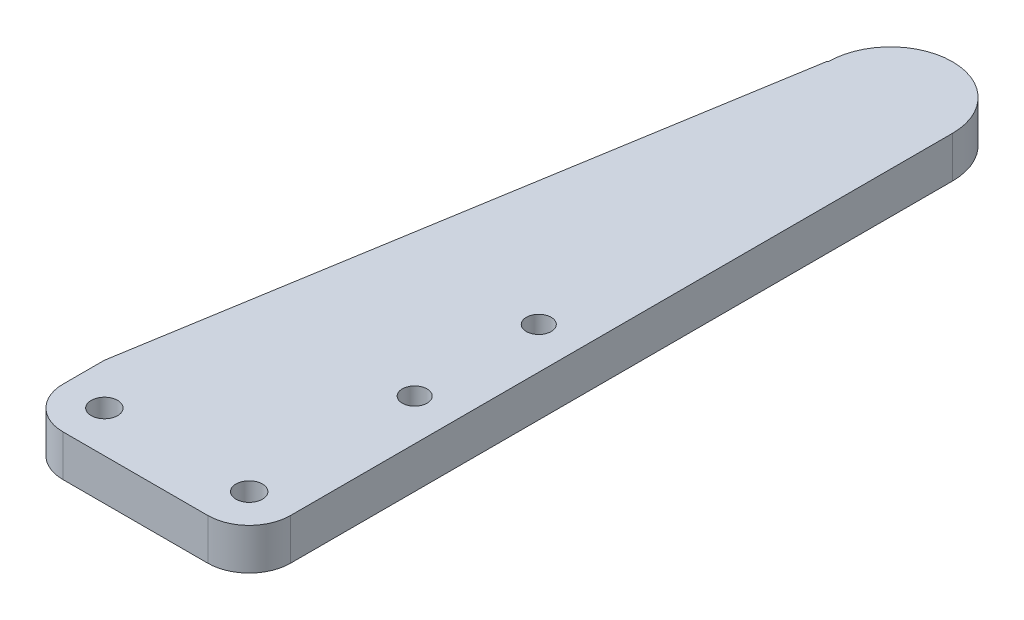
ISO-10303-21;
HEADER;
FILE_DESCRIPTION(('STEP AP214'),'2;1');
FILE_NAME('part.step','',(''),(''),'','','');
FILE_SCHEMA(('AUTOMOTIVE_DESIGN { 1 0 10303 214 1 1 1 1 }'));
ENDSEC;
DATA;
#1=APPLICATION_CONTEXT('core data for automotive mechanical design processes');
#2=APPLICATION_PROTOCOL_DEFINITION('international standard','automotive_design',2000,#1);
#3=PRODUCT_CONTEXT('',#1,'mechanical');
#4=PRODUCT('Part','Part','',(#3));
#5=PRODUCT_RELATED_PRODUCT_CATEGORY('part','',(#4));
#6=PRODUCT_DEFINITION_FORMATION('','',#4);
#7=PRODUCT_DEFINITION_CONTEXT('part definition',#1,'design');
#8=PRODUCT_DEFINITION('design','',#6,#7);
#9=PRODUCT_DEFINITION_SHAPE('','',#8);
#10=(LENGTH_UNIT() NAMED_UNIT(*) SI_UNIT(.MILLI.,.METRE.));
#11=(NAMED_UNIT(*) PLANE_ANGLE_UNIT() SI_UNIT($,.RADIAN.));
#12=(NAMED_UNIT(*) SI_UNIT($,.STERADIAN.) SOLID_ANGLE_UNIT());
#13=UNCERTAINTY_MEASURE_WITH_UNIT(LENGTH_MEASURE(1.E-05),#10,'distance_accuracy_value','');
#14=(GEOMETRIC_REPRESENTATION_CONTEXT(3) GLOBAL_UNCERTAINTY_ASSIGNED_CONTEXT((#13)) GLOBAL_UNIT_ASSIGNED_CONTEXT((#10,
#11,#12)) REPRESENTATION_CONTEXT('',''));
#15=CARTESIAN_POINT('',(0.,0.,0.));
#16=DIRECTION('',(0.,0.,1.));
#17=DIRECTION('',(1.,0.,0.));
#18=AXIS2_PLACEMENT_3D('',#15,#16,#17);
#19=CARTESIAN_POINT('',(6.25000000000002,5.,-42.5));
#20=DIRECTION('',(0.,-1.,0.));
#21=DIRECTION('',(0.,0.,-1.));
#22=AXIS2_PLACEMENT_3D('',#19,#20,#21);
#23=CYLINDRICAL_SURFACE('',#22,7.49999999999999);
#24=CARTESIAN_POINT('',(6.25000000000002,0.,-42.5));
#25=DIRECTION('',(0.,1.,0.));
#26=DIRECTION('',(0.,0.,1.));
#27=AXIS2_PLACEMENT_3D('',#24,#25,#26);
#28=CIRCLE('',#27,7.49999999999999);
#29=CARTESIAN_POINT('',(13.75,0.,-42.5));
#30=VERTEX_POINT('',#29);
#31=CARTESIAN_POINT('',(-1.24999999999997,0.,-42.5));
#32=VERTEX_POINT('',#31);
#33=EDGE_CURVE('E119',#30,#32,#28,.T.);
#34=ORIENTED_EDGE('',*,*,#33,.T.);
#35=DIRECTION('',(0.,-1.,0.));
#36=VECTOR('',#35,1.);
#37=CARTESIAN_POINT('',(-1.24999999999997,5.,-42.5));
#38=LINE('',#37,#36);
#39=CARTESIAN_POINT('',(-1.24999999999997,5.,-42.5));
#40=VERTEX_POINT('',#39);
#41=EDGE_CURVE('E117',#40,#32,#38,.T.);
#42=ORIENTED_EDGE('',*,*,#41,.F.);
#43=CARTESIAN_POINT('',(6.25000000000002,5.,-42.5));
#44=DIRECTION('',(0.,1.,0.));
#45=DIRECTION('',(0.,0.,1.));
#46=AXIS2_PLACEMENT_3D('',#43,#44,#45);
#47=CIRCLE('',#46,7.49999999999999);
#48=CARTESIAN_POINT('',(13.75,5.,-42.5));
#49=VERTEX_POINT('',#48);
#50=EDGE_CURVE('E103',#49,#40,#47,.T.);
#51=ORIENTED_EDGE('',*,*,#50,.F.);
#52=DIRECTION('',(0.,-1.,0.));
#53=VECTOR('',#52,1.);
#54=CARTESIAN_POINT('',(13.75,5.,-42.5));
#55=LINE('',#54,#53);
#56=EDGE_CURVE('E149',#49,#30,#55,.T.);
#57=ORIENTED_EDGE('',*,*,#56,.T.);
#58=EDGE_LOOP('',(#34,#42,#51,#57));
#59=FACE_BOUND('',#58,.T.);
#60=ADVANCED_FACE('F37',(#59),#23,.T.);
#61=CARTESIAN_POINT('',(0.,5.,-42.5));
#62=DIRECTION('',(0.,0.,-1.));
#63=DIRECTION('',(-1.,0.,0.));
#64=AXIS2_PLACEMENT_3D('',#61,#62,#63);
#65=PLANE('',#64);
#66=DIRECTION('',(1.,0.,0.));
#67=VECTOR('',#66,1.);
#68=CARTESIAN_POINT('',(0.,0.,-42.5));
#69=LINE('',#68,#67);
#70=CARTESIAN_POINT('',(-1.35178643452647,0.,-42.5));
#71=VERTEX_POINT('',#70);
#72=EDGE_CURVE('E151',#71,#32,#69,.T.);
#73=ORIENTED_EDGE('',*,*,#72,.F.);
#74=DIRECTION('',(0.,-1.,0.));
#75=VECTOR('',#74,1.);
#76=CARTESIAN_POINT('',(-1.35178643452647,5.,-42.5));
#77=LINE('',#76,#75);
#78=CARTESIAN_POINT('',(-1.35178643452647,5.,-42.5));
#79=VERTEX_POINT('',#78);
#80=EDGE_CURVE('E124',#79,#71,#77,.T.);
#81=ORIENTED_EDGE('',*,*,#80,.F.);
#82=DIRECTION('',(1.,0.,0.));
#83=VECTOR('',#82,1.);
#84=CARTESIAN_POINT('',(0.,5.,-42.5));
#85=LINE('',#84,#83);
#86=EDGE_CURVE('E109',#79,#40,#85,.T.);
#87=ORIENTED_EDGE('',*,*,#86,.T.);
#88=ORIENTED_EDGE('',*,*,#41,.T.);
#89=EDGE_LOOP('',(#73,#81,#87,#88));
#90=FACE_BOUND('',#89,.T.);
#91=ADVANCED_FACE('F126',(#90),#65,.T.);
#92=CARTESIAN_POINT('',(-8.15459816396523,5.,-1.34803266103279));
#93=DIRECTION('',(0.986610195458243,0.,0.163096052122198));
#94=DIRECTION('',(0.163096052122198,0.,-0.986610195458243));
#95=AXIS2_PLACEMENT_3D('',#92,#93,#94);
#96=PLANE('',#95);
#97=DIRECTION('',(-0.163096052122198,0.,0.986610195458243));
#98=VECTOR('',#97,1.);
#99=CARTESIAN_POINT('',(-8.15459816396523,0.,-1.34803266103279));
#100=LINE('',#99,#98);
#101=CARTESIAN_POINT('',(-13.75,0.,32.5));
#102=VERTEX_POINT('',#101);
#103=EDGE_CURVE('E153',#71,#102,#100,.T.);
#104=ORIENTED_EDGE('',*,*,#103,.T.);
#105=DIRECTION('',(0.,-1.,0.));
#106=VECTOR('',#105,1.);
#107=CARTESIAN_POINT('',(-13.75,5.,32.5));
#108=LINE('',#107,#106);
#109=CARTESIAN_POINT('',(-13.75,5.,32.5));
#110=VERTEX_POINT('',#109);
#111=EDGE_CURVE('E175',#110,#102,#108,.T.);
#112=ORIENTED_EDGE('',*,*,#111,.F.);
#113=DIRECTION('',(-0.163096052122198,0.,0.986610195458243));
#114=VECTOR('',#113,1.);
#115=CARTESIAN_POINT('',(-8.15459816396523,5.,-1.34803266103279));
#116=LINE('',#115,#114);
#117=EDGE_CURVE('E128',#79,#110,#116,.T.);
#118=ORIENTED_EDGE('',*,*,#117,.F.);
#119=ORIENTED_EDGE('',*,*,#80,.T.);
#120=EDGE_LOOP('',(#104,#112,#118,#119));
#121=FACE_BOUND('',#120,.T.);
#122=ADVANCED_FACE('F204',(#121),#96,.F.);
#123=CARTESIAN_POINT('',(-13.75,5.,0.));
#124=DIRECTION('',(-1.,0.,0.));
#125=DIRECTION('',(0.,0.,1.));
#126=AXIS2_PLACEMENT_3D('',#123,#124,#125);
#127=PLANE('',#126);
#128=DIRECTION('',(0.,0.,-1.));
#129=VECTOR('',#128,1.);
#130=CARTESIAN_POINT('',(-13.75,0.,0.));
#131=LINE('',#130,#129);
#132=CARTESIAN_POINT('',(-13.75,0.,37.5));
#133=VERTEX_POINT('',#132);
#134=EDGE_CURVE('E156',#133,#102,#131,.T.);
#135=ORIENTED_EDGE('',*,*,#134,.F.);
#136=DIRECTION('',(0.,-1.,0.));
#137=VECTOR('',#136,1.);
#138=CARTESIAN_POINT('',(-13.75,5.,37.5));
#139=LINE('',#138,#137);
#140=CARTESIAN_POINT('',(-13.75,5.,37.5));
#141=VERTEX_POINT('',#140);
#142=EDGE_CURVE('E60',#133,#141,#139,.F.);
#143=ORIENTED_EDGE('',*,*,#142,.T.);
#144=DIRECTION('',(0.,0.,-1.));
#145=VECTOR('',#144,1.);
#146=CARTESIAN_POINT('',(-13.75,5.,0.));
#147=LINE('',#146,#145);
#148=EDGE_CURVE('E130',#141,#110,#147,.T.);
#149=ORIENTED_EDGE('',*,*,#148,.T.);
#150=ORIENTED_EDGE('',*,*,#111,.T.);
#151=EDGE_LOOP('',(#135,#143,#149,#150));
#152=FACE_BOUND('',#151,.T.);
#153=ADVANCED_FACE('F201',(#152),#127,.T.);
#154=CARTESIAN_POINT('',(0.,5.,42.5));
#155=DIRECTION('',(0.,0.,-1.));
#156=DIRECTION('',(-1.,0.,0.));
#157=AXIS2_PLACEMENT_3D('',#154,#155,#156);
#158=PLANE('',#157);
#159=DIRECTION('',(1.,0.,0.));
#160=VECTOR('',#159,1.);
#161=CARTESIAN_POINT('',(0.,5.,42.5));
#162=LINE('',#161,#160);
#163=CARTESIAN_POINT('',(-8.75,5.,42.5));
#164=VERTEX_POINT('',#163);
#165=CARTESIAN_POINT('',(8.75000000000001,5.,42.5));
#166=VERTEX_POINT('',#165);
#167=EDGE_CURVE('E134',#164,#166,#162,.T.);
#168=ORIENTED_EDGE('',*,*,#167,.F.);
#169=DIRECTION('',(0.,-1.,0.));
#170=VECTOR('',#169,1.);
#171=CARTESIAN_POINT('',(-8.75,0.,42.5));
#172=LINE('',#171,#170);
#173=CARTESIAN_POINT('',(-8.75,0.,42.5));
#174=VERTEX_POINT('',#173);
#175=EDGE_CURVE('E180',#164,#174,#172,.T.);
#176=ORIENTED_EDGE('',*,*,#175,.T.);
#177=DIRECTION('',(1.,0.,0.));
#178=VECTOR('',#177,1.);
#179=CARTESIAN_POINT('',(0.,0.,42.5));
#180=LINE('',#179,#178);
#181=CARTESIAN_POINT('',(8.75000000000001,0.,42.5));
#182=VERTEX_POINT('',#181);
#183=EDGE_CURVE('E158',#174,#182,#180,.T.);
#184=ORIENTED_EDGE('',*,*,#183,.T.);
#185=DIRECTION('',(0.,-1.,0.));
#186=VECTOR('',#185,1.);
#187=CARTESIAN_POINT('',(8.75000000000001,5.,42.5));
#188=LINE('',#187,#186);
#189=EDGE_CURVE('E123',#182,#166,#188,.F.);
#190=ORIENTED_EDGE('',*,*,#189,.T.);
#191=EDGE_LOOP('',(#168,#176,#184,#190));
#192=FACE_BOUND('',#191,.T.);
#193=ADVANCED_FACE('F193',(#192),#158,.F.);
#194=CARTESIAN_POINT('',(-8.75,5.,37.5));
#195=DIRECTION('',(0.,-1.,0.));
#196=DIRECTION('',(0.,0.,-1.));
#197=AXIS2_PLACEMENT_3D('',#194,#195,#196);
#198=CYLINDRICAL_SURFACE('',#197,1.59999999999999);
#199=CARTESIAN_POINT('',(-8.75,5.,37.5));
#200=DIRECTION('',(0.,1.,0.));
#201=DIRECTION('',(0.,0.,1.));
#202=AXIS2_PLACEMENT_3D('',#199,#200,#201);
#203=CIRCLE('',#202,1.59999999999999);
#204=CARTESIAN_POINT('',(-8.75,5.,39.1));
#205=VERTEX_POINT('',#204);
#206=EDGE_CURVE('E143',#205,#205,#203,.T.);
#207=ORIENTED_EDGE('',*,*,#206,.T.);
#208=EDGE_LOOP('',(#207));
#209=FACE_BOUND('',#208,.T.);
#210=CARTESIAN_POINT('',(-8.75,0.,37.5));
#211=DIRECTION('',(0.,1.,0.));
#212=DIRECTION('',(0.,0.,1.));
#213=AXIS2_PLACEMENT_3D('',#210,#211,#212);
#214=CIRCLE('',#213,1.59999999999999);
#215=CARTESIAN_POINT('',(-8.75,0.,39.1));
#216=VERTEX_POINT('',#215);
#217=EDGE_CURVE('E169',#216,#216,#214,.T.);
#218=ORIENTED_EDGE('',*,*,#217,.F.);
#219=EDGE_LOOP('',(#218));
#220=FACE_BOUND('',#219,.T.);
#221=ADVANCED_FACE('F227',(#209,#220),#198,.F.);
#222=CARTESIAN_POINT('',(8.75000000000001,5.,17.5));
#223=DIRECTION('',(0.,-1.,0.));
#224=DIRECTION('',(0.,0.,-1.));
#225=AXIS2_PLACEMENT_3D('',#222,#223,#224);
#226=CYLINDRICAL_SURFACE('',#225,1.5);
#227=CARTESIAN_POINT('',(8.75000000000001,5.,17.5));
#228=DIRECTION('',(0.,1.,0.));
#229=DIRECTION('',(0.,0.,1.));
#230=AXIS2_PLACEMENT_3D('',#227,#228,#229);
#231=CIRCLE('',#230,1.5);
#232=CARTESIAN_POINT('',(8.75000000000001,5.,19.));
#233=VERTEX_POINT('',#232);
#234=EDGE_CURVE('E140',#233,#233,#231,.T.);
#235=ORIENTED_EDGE('',*,*,#234,.T.);
#236=EDGE_LOOP('',(#235));
#237=FACE_BOUND('',#236,.T.);
#238=CARTESIAN_POINT('',(8.75000000000001,0.,17.5));
#239=DIRECTION('',(0.,1.,0.));
#240=DIRECTION('',(0.,0.,1.));
#241=AXIS2_PLACEMENT_3D('',#238,#239,#240);
#242=CIRCLE('',#241,1.5);
#243=CARTESIAN_POINT('',(8.75000000000001,0.,19.));
#244=VERTEX_POINT('',#243);
#245=EDGE_CURVE('E166',#244,#244,#242,.T.);
#246=ORIENTED_EDGE('',*,*,#245,.F.);
#247=EDGE_LOOP('',(#246));
#248=FACE_BOUND('',#247,.T.);
#249=ADVANCED_FACE('F234',(#237,#248),#226,.F.);
#250=CARTESIAN_POINT('',(8.75000000000001,5.,2.5));
#251=DIRECTION('',(0.,-1.,0.));
#252=DIRECTION('',(0.,0.,-1.));
#253=AXIS2_PLACEMENT_3D('',#250,#251,#252);
#254=CYLINDRICAL_SURFACE('',#253,1.5);
#255=CARTESIAN_POINT('',(8.75000000000001,5.,2.5));
#256=DIRECTION('',(0.,1.,0.));
#257=DIRECTION('',(0.,0.,1.));
#258=AXIS2_PLACEMENT_3D('',#255,#256,#257);
#259=CIRCLE('',#258,1.5);
#260=CARTESIAN_POINT('',(8.75000000000001,5.,4.));
#261=VERTEX_POINT('',#260);
#262=EDGE_CURVE('E137',#261,#261,#259,.T.);
#263=ORIENTED_EDGE('',*,*,#262,.T.);
#264=EDGE_LOOP('',(#263));
#265=FACE_BOUND('',#264,.T.);
#266=CARTESIAN_POINT('',(8.75000000000001,0.,2.5));
#267=DIRECTION('',(0.,1.,0.));
#268=DIRECTION('',(0.,0.,1.));
#269=AXIS2_PLACEMENT_3D('',#266,#267,#268);
#270=CIRCLE('',#269,1.5);
#271=CARTESIAN_POINT('',(8.75000000000001,0.,4.));
#272=VERTEX_POINT('',#271);
#273=EDGE_CURVE('E163',#272,#272,#270,.T.);
#274=ORIENTED_EDGE('',*,*,#273,.F.);
#275=EDGE_LOOP('',(#274));
#276=FACE_BOUND('',#275,.T.);
#277=ADVANCED_FACE('F231',(#265,#276),#254,.F.);
#278=CARTESIAN_POINT('',(13.75,5.,0.));
#279=DIRECTION('',(-1.,0.,0.));
#280=DIRECTION('',(0.,0.,1.));
#281=AXIS2_PLACEMENT_3D('',#278,#279,#280);
#282=PLANE('',#281);
#283=DIRECTION('',(0.,0.,-1.));
#284=VECTOR('',#283,1.);
#285=CARTESIAN_POINT('',(13.75,5.,0.));
#286=LINE('',#285,#284);
#287=CARTESIAN_POINT('',(13.75,5.,37.5));
#288=VERTEX_POINT('',#287);
#289=EDGE_CURVE('E110',#288,#49,#286,.T.);
#290=ORIENTED_EDGE('',*,*,#289,.F.);
#291=DIRECTION('',(0.,-1.,0.));
#292=VECTOR('',#291,1.);
#293=CARTESIAN_POINT('',(13.75,5.,37.5));
#294=LINE('',#293,#292);
#295=CARTESIAN_POINT('',(13.75,0.,37.5));
#296=VERTEX_POINT('',#295);
#297=EDGE_CURVE('E11',#288,#296,#294,.T.);
#298=ORIENTED_EDGE('',*,*,#297,.T.);
#299=DIRECTION('',(0.,0.,-1.));
#300=VECTOR('',#299,1.);
#301=CARTESIAN_POINT('',(13.75,0.,0.));
#302=LINE('',#301,#300);
#303=EDGE_CURVE('E161',#296,#30,#302,.T.);
#304=ORIENTED_EDGE('',*,*,#303,.T.);
#305=ORIENTED_EDGE('',*,*,#56,.F.);
#306=EDGE_LOOP('',(#290,#298,#304,#305));
#307=FACE_BOUND('',#306,.T.);
#308=ADVANCED_FACE('F207',(#307),#282,.F.);
#309=CARTESIAN_POINT('',(8.75000000000001,5.,37.5));
#310=DIRECTION('',(0.,-1.,0.));
#311=DIRECTION('',(0.,0.,-1.));
#312=AXIS2_PLACEMENT_3D('',#309,#310,#311);
#313=CYLINDRICAL_SURFACE('',#312,1.6);
#314=CARTESIAN_POINT('',(8.75000000000001,5.,37.5));
#315=DIRECTION('',(0.,1.,0.));
#316=DIRECTION('',(0.,0.,1.));
#317=AXIS2_PLACEMENT_3D('',#314,#315,#316);
#318=CIRCLE('',#317,1.6);
#319=CARTESIAN_POINT('',(8.75000000000001,5.,39.1));
#320=VERTEX_POINT('',#319);
#321=EDGE_CURVE('E146',#320,#320,#318,.F.);
#322=ORIENTED_EDGE('',*,*,#321,.F.);
#323=EDGE_LOOP('',(#322));
#324=FACE_BOUND('',#323,.T.);
#325=CARTESIAN_POINT('',(8.75000000000001,0.,37.5));
#326=DIRECTION('',(0.,1.,0.));
#327=DIRECTION('',(0.,0.,1.));
#328=AXIS2_PLACEMENT_3D('',#325,#326,#327);
#329=CIRCLE('',#328,1.6);
#330=CARTESIAN_POINT('',(8.75000000000001,0.,39.1));
#331=VERTEX_POINT('',#330);
#332=EDGE_CURVE('E114',#331,#331,#329,.F.);
#333=ORIENTED_EDGE('',*,*,#332,.T.);
#334=EDGE_LOOP('',(#333));
#335=FACE_BOUND('',#334,.T.);
#336=ADVANCED_FACE('F230',(#324,#335),#313,.F.);
#337=CARTESIAN_POINT('',(0.,5.,0.));
#338=DIRECTION('',(0.,1.,0.));
#339=DIRECTION('',(0.,0.,1.));
#340=AXIS2_PLACEMENT_3D('',#337,#338,#339);
#341=PLANE('',#340);
#342=ORIENTED_EDGE('',*,*,#148,.F.);
#343=CARTESIAN_POINT('',(-8.75,5.,37.5));
#344=DIRECTION('',(0.,1.,0.));
#345=DIRECTION('',(0.,0.,1.));
#346=AXIS2_PLACEMENT_3D('',#343,#344,#345);
#347=CIRCLE('',#346,5.);
#348=EDGE_CURVE('E45',#141,#164,#347,.T.);
#349=ORIENTED_EDGE('',*,*,#348,.T.);
#350=ORIENTED_EDGE('',*,*,#167,.T.);
#351=CARTESIAN_POINT('',(8.75000000000001,5.,37.5));
#352=DIRECTION('',(0.,1.,0.));
#353=DIRECTION('',(0.,0.,1.));
#354=AXIS2_PLACEMENT_3D('',#351,#352,#353);
#355=CIRCLE('',#354,5.);
#356=EDGE_CURVE('E52',#166,#288,#355,.T.);
#357=ORIENTED_EDGE('',*,*,#356,.T.);
#358=ORIENTED_EDGE('',*,*,#289,.T.);
#359=ORIENTED_EDGE('',*,*,#50,.T.);
#360=ORIENTED_EDGE('',*,*,#86,.F.);
#361=ORIENTED_EDGE('',*,*,#117,.T.);
#362=EDGE_LOOP('',(#342,#349,#350,#357,#358,#359,#360,#361));
#363=FACE_BOUND('',#362,.T.);
#364=ORIENTED_EDGE('',*,*,#262,.F.);
#365=EDGE_LOOP('',(#364));
#366=FACE_BOUND('',#365,.T.);
#367=ORIENTED_EDGE('',*,*,#234,.F.);
#368=EDGE_LOOP('',(#367));
#369=FACE_BOUND('',#368,.T.);
#370=ORIENTED_EDGE('',*,*,#206,.F.);
#371=EDGE_LOOP('',(#370));
#372=FACE_BOUND('',#371,.T.);
#373=ORIENTED_EDGE('',*,*,#321,.T.);
#374=EDGE_LOOP('',(#373));
#375=FACE_BOUND('',#374,.T.);
#376=ADVANCED_FACE('F105',(#363,#366,#369,#372,#375),#341,.T.);
#377=CARTESIAN_POINT('',(0.,0.,0.));
#378=DIRECTION('',(0.,1.,0.));
#379=DIRECTION('',(0.,0.,1.));
#380=AXIS2_PLACEMENT_3D('',#377,#378,#379);
#381=PLANE('',#380);
#382=ORIENTED_EDGE('',*,*,#183,.F.);
#383=CARTESIAN_POINT('',(-8.75,0.,37.5));
#384=DIRECTION('',(0.,1.,0.));
#385=DIRECTION('',(0.,0.,1.));
#386=AXIS2_PLACEMENT_3D('',#383,#384,#385);
#387=CIRCLE('',#386,5.);
#388=EDGE_CURVE('E185',#174,#133,#387,.F.);
#389=ORIENTED_EDGE('',*,*,#388,.T.);
#390=ORIENTED_EDGE('',*,*,#134,.T.);
#391=ORIENTED_EDGE('',*,*,#103,.F.);
#392=ORIENTED_EDGE('',*,*,#72,.T.);
#393=ORIENTED_EDGE('',*,*,#33,.F.);
#394=ORIENTED_EDGE('',*,*,#303,.F.);
#395=CARTESIAN_POINT('',(8.75000000000001,0.,37.5));
#396=DIRECTION('',(0.,1.,0.));
#397=DIRECTION('',(0.,0.,1.));
#398=AXIS2_PLACEMENT_3D('',#395,#396,#397);
#399=CIRCLE('',#398,5.);
#400=EDGE_CURVE('E183',#296,#182,#399,.F.);
#401=ORIENTED_EDGE('',*,*,#400,.T.);
#402=EDGE_LOOP('',(#382,#389,#390,#391,#392,#393,#394,#401));
#403=FACE_BOUND('',#402,.T.);
#404=ORIENTED_EDGE('',*,*,#273,.T.);
#405=EDGE_LOOP('',(#404));
#406=FACE_BOUND('',#405,.T.);
#407=ORIENTED_EDGE('',*,*,#245,.T.);
#408=EDGE_LOOP('',(#407));
#409=FACE_BOUND('',#408,.T.);
#410=ORIENTED_EDGE('',*,*,#217,.T.);
#411=EDGE_LOOP('',(#410));
#412=FACE_BOUND('',#411,.T.);
#413=ORIENTED_EDGE('',*,*,#332,.F.);
#414=EDGE_LOOP('',(#413));
#415=FACE_BOUND('',#414,.T.);
#416=ADVANCED_FACE('F198',(#403,#406,#409,#412,#415),#381,.F.);
#417=CARTESIAN_POINT('',(-8.75,5.,37.5));
#418=DIRECTION('',(0.,1.,0.));
#419=DIRECTION('',(0.,0.,1.));
#420=AXIS2_PLACEMENT_3D('',#417,#418,#419);
#421=CYLINDRICAL_SURFACE('',#420,5.);
#422=ORIENTED_EDGE('',*,*,#348,.F.);
#423=ORIENTED_EDGE('',*,*,#142,.F.);
#424=ORIENTED_EDGE('',*,*,#388,.F.);
#425=ORIENTED_EDGE('',*,*,#175,.F.);
#426=EDGE_LOOP('',(#422,#423,#424,#425));
#427=FACE_BOUND('',#426,.T.);
#428=ADVANCED_FACE('F196',(#427),#421,.T.);
#429=CARTESIAN_POINT('',(8.75000000000001,5.,37.5));
#430=DIRECTION('',(0.,-1.,0.));
#431=DIRECTION('',(0.,0.,-1.));
#432=AXIS2_PLACEMENT_3D('',#429,#430,#431);
#433=CYLINDRICAL_SURFACE('',#432,5.);
#434=ORIENTED_EDGE('',*,*,#356,.F.);
#435=ORIENTED_EDGE('',*,*,#189,.F.);
#436=ORIENTED_EDGE('',*,*,#400,.F.);
#437=ORIENTED_EDGE('',*,*,#297,.F.);
#438=EDGE_LOOP('',(#434,#435,#436,#437));
#439=FACE_BOUND('',#438,.T.);
#440=ADVANCED_FACE('F39',(#439),#433,.T.);
#441=CLOSED_SHELL('',(#60,#91,#122,#153,#193,#221,#249,#277,#308,#336,#376,#416,#428,#440));
#442=MANIFOLD_SOLID_BREP('B2',#441);
#443=ADVANCED_BREP_SHAPE_REPRESENTATION('',(#18,#442),#14);
#444=SHAPE_DEFINITION_REPRESENTATION(#9,#443);
ENDSEC;
END-ISO-10303-21;
